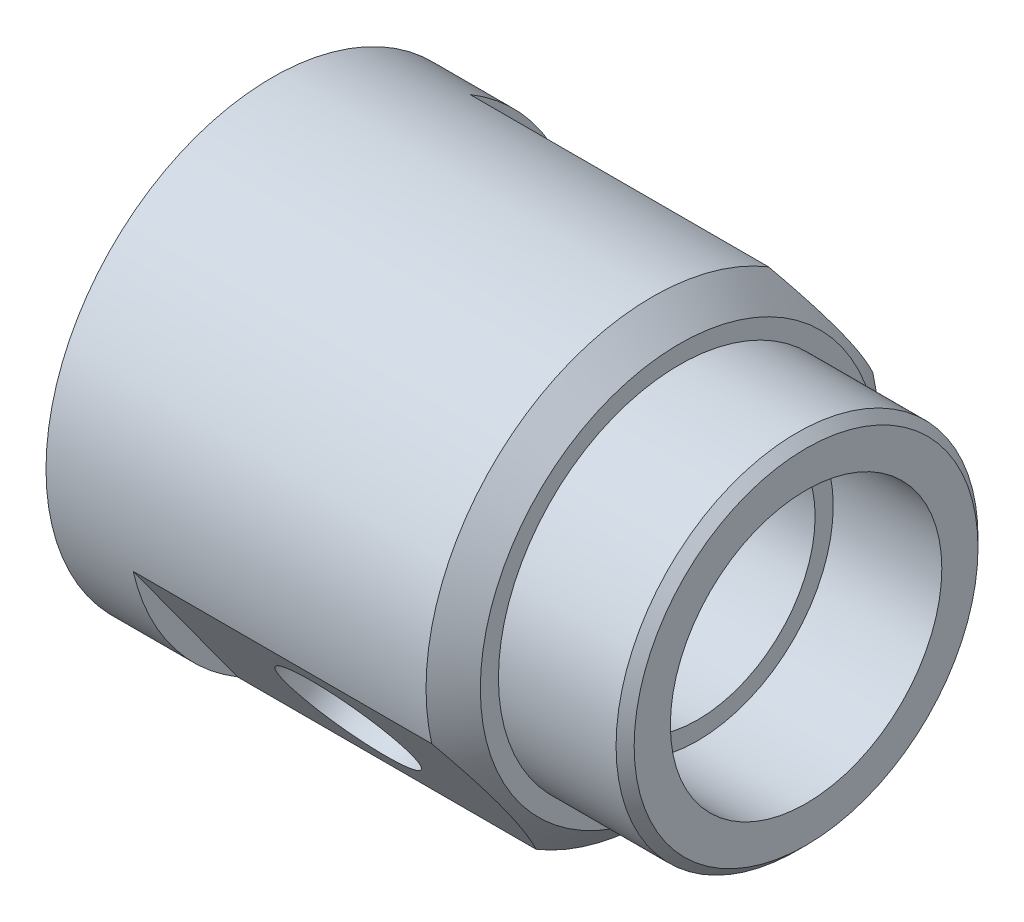
ISO-10303-21;
HEADER;
FILE_DESCRIPTION(('STEP AP214'),'2;1');
FILE_NAME('part.step','',(''),(''),'','','');
FILE_SCHEMA(('AUTOMOTIVE_DESIGN { 1 0 10303 214 1 1 1 1 }'));
ENDSEC;
DATA;
#1=APPLICATION_CONTEXT('core data for automotive mechanical design processes');
#2=APPLICATION_PROTOCOL_DEFINITION('international standard','automotive_design',2000,#1);
#3=PRODUCT_CONTEXT('',#1,'mechanical');
#4=PRODUCT('Part','Part','',(#3));
#5=PRODUCT_RELATED_PRODUCT_CATEGORY('part','',(#4));
#6=PRODUCT_DEFINITION_FORMATION('','',#4);
#7=PRODUCT_DEFINITION_CONTEXT('part definition',#1,'design');
#8=PRODUCT_DEFINITION('design','',#6,#7);
#9=PRODUCT_DEFINITION_SHAPE('','',#8);
#10=(LENGTH_UNIT() NAMED_UNIT(*) SI_UNIT(.MILLI.,.METRE.));
#11=(NAMED_UNIT(*) PLANE_ANGLE_UNIT() SI_UNIT($,.RADIAN.));
#12=(NAMED_UNIT(*) SI_UNIT($,.STERADIAN.) SOLID_ANGLE_UNIT());
#13=UNCERTAINTY_MEASURE_WITH_UNIT(LENGTH_MEASURE(1.E-05),#10,'distance_accuracy_value','');
#14=(GEOMETRIC_REPRESENTATION_CONTEXT(3) GLOBAL_UNCERTAINTY_ASSIGNED_CONTEXT((#13)) GLOBAL_UNIT_ASSIGNED_CONTEXT((#10,
#11,#12)) REPRESENTATION_CONTEXT('',''));
#15=CARTESIAN_POINT('',(0.,0.,0.));
#16=DIRECTION('',(0.,0.,1.));
#17=DIRECTION('',(1.,0.,0.));
#18=AXIS2_PLACEMENT_3D('',#15,#16,#17);
#19=CARTESIAN_POINT('',(-39.,13.079846408453,-14.600260885727));
#20=DIRECTION('',(1.,0.,0.));
#21=DIRECTION('',(0.,-0.809016994375046,-0.587785252292338));
#22=AXIS2_PLACEMENT_3D('',#19,#20,#21);
#23=PLANE('',#22);
#24=CARTESIAN_POINT('',(-39.,12.637382924288,-17.393865379061));
#25=DIRECTION('',(-1.,0.,0.));
#26=DIRECTION('',(0.,0.,1.));
#27=AXIS2_PLACEMENT_3D('',#24,#25,#26);
#28=CIRCLE('',#27,2.00000000000012);
#29=CARTESIAN_POINT('',(-39.,12.637382924288,-15.3938653790609));
#30=VERTEX_POINT('',#29);
#31=EDGE_CURVE('E252',#30,#30,#28,.F.);
#32=ORIENTED_EDGE('',*,*,#31,.F.);
#33=EDGE_LOOP('',(#32));
#34=FACE_BOUND('',#33,.T.);
#35=ADVANCED_FACE('F17',(#34),#23,.F.);
#36=CARTESIAN_POINT('',(-39.,-12.194919440123,20.187469872396));
#37=DIRECTION('',(1.,0.,0.));
#38=DIRECTION('',(0.,-0.809016994374953,-0.587785252292465));
#39=AXIS2_PLACEMENT_3D('',#36,#37,#38);
#40=PLANE('',#39);
#41=CARTESIAN_POINT('',(-39.,-12.637382924288,17.393865379061));
#42=DIRECTION('',(-1.,0.,0.));
#43=DIRECTION('',(0.,0.,1.));
#44=AXIS2_PLACEMENT_3D('',#41,#42,#43);
#45=CIRCLE('',#44,2.00000000000011);
#46=CARTESIAN_POINT('',(-39.,-12.637382924288,19.3938653790611));
#47=VERTEX_POINT('',#46);
#48=EDGE_CURVE('E249',#47,#47,#45,.F.);
#49=ORIENTED_EDGE('',*,*,#48,.F.);
#50=EDGE_LOOP('',(#49));
#51=FACE_BOUND('',#50,.T.);
#52=ADVANCED_FACE('F152',(#51),#40,.F.);
#53=CARTESIAN_POINT('',(-43.,-20.952033700011,3.3184761312371));
#54=DIRECTION('',(-1.,0.,0.));
#55=DIRECTION('',(0.,0.809016994374948,0.587785252292472));
#56=AXIS2_PLACEMENT_3D('',#53,#54,#55);
#57=PLANE('',#56);
#58=CARTESIAN_POINT('',(-43.,0.,0.));
#59=DIRECTION('',(-1.,0.,0.));
#60=DIRECTION('',(0.,0.,1.));
#61=AXIS2_PLACEMENT_3D('',#58,#59,#60);
#62=CIRCLE('',#61,12.9999999999998);
#63=CARTESIAN_POINT('',(-43.,0.,12.9999999999998));
#64=VERTEX_POINT('',#63);
#65=EDGE_CURVE('E247',#64,#64,#62,.T.);
#66=ORIENTED_EDGE('',*,*,#65,.F.);
#67=EDGE_LOOP('',(#66));
#68=FACE_BOUND('',#67,.T.);
#69=CARTESIAN_POINT('',(-43.0000000000001,0.,0.));
#70=DIRECTION('',(-1.,0.,0.));
#71=DIRECTION('',(0.,0.,1.));
#72=AXIS2_PLACEMENT_3D('',#69,#70,#71);
#73=CIRCLE('',#72,14.9999999999998);
#74=CARTESIAN_POINT('',(-43.0000000000001,0.,14.9999999999998));
#75=VERTEX_POINT('',#74);
#76=EDGE_CURVE('E261',#75,#75,#73,.F.);
#77=ORIENTED_EDGE('',*,*,#76,.F.);
#78=EDGE_LOOP('',(#77));
#79=FACE_BOUND('',#78,.T.);
#80=ADVANCED_FACE('F156',(#68,#79),#57,.T.);
#81=CARTESIAN_POINT('',(-43.0000000000001,0.,0.));
#82=DIRECTION('',(-1.,0.,0.));
#83=DIRECTION('',(0.,0.,1.));
#84=AXIS2_PLACEMENT_3D('',#81,#82,#83);
#85=CYLINDRICAL_SURFACE('',#84,14.9999999999998);
#86=ORIENTED_EDGE('',*,*,#76,.T.);
#87=EDGE_LOOP('',(#86));
#88=FACE_BOUND('',#87,.T.);
#89=CARTESIAN_POINT('',(-47.,0.,0.));
#90=DIRECTION('',(-1.,0.,0.));
#91=DIRECTION('',(0.,0.,1.));
#92=AXIS2_PLACEMENT_3D('',#89,#90,#91);
#93=CIRCLE('',#92,14.9999999999998);
#94=CARTESIAN_POINT('',(-47.,0.,14.9999999999998));
#95=VERTEX_POINT('',#94);
#96=EDGE_CURVE('E208',#95,#95,#93,.F.);
#97=ORIENTED_EDGE('',*,*,#96,.F.);
#98=EDGE_LOOP('',(#97));
#99=FACE_BOUND('',#98,.T.);
#100=ADVANCED_FACE('F160',(#88,#99),#85,.F.);
#101=CARTESIAN_POINT('',(-39.,12.637382924288,-17.393865379061));
#102=DIRECTION('',(-1.,0.,0.));
#103=DIRECTION('',(0.,0.,1.));
#104=AXIS2_PLACEMENT_3D('',#101,#102,#103);
#105=CYLINDRICAL_SURFACE('',#104,2.00000000000012);
#106=ORIENTED_EDGE('',*,*,#31,.T.);
#107=EDGE_LOOP('',(#106));
#108=FACE_BOUND('',#107,.T.);
#109=CARTESIAN_POINT('',(-47.,12.637382924288,-17.393865379061));
#110=DIRECTION('',(-1.,0.,0.));
#111=DIRECTION('',(0.,0.,1.));
#112=AXIS2_PLACEMENT_3D('',#109,#110,#111);
#113=CIRCLE('',#112,2.00000000000012);
#114=CARTESIAN_POINT('',(-47.,12.637382924288,-15.3938653790609));
#115=VERTEX_POINT('',#114);
#116=EDGE_CURVE('E203',#115,#115,#113,.F.);
#117=ORIENTED_EDGE('',*,*,#116,.F.);
#118=EDGE_LOOP('',(#117));
#119=FACE_BOUND('',#118,.T.);
#120=ADVANCED_FACE('F269',(#108,#119),#105,.F.);
#121=CARTESIAN_POINT('',(-39.,-12.637382924288,17.393865379061));
#122=DIRECTION('',(-1.,0.,0.));
#123=DIRECTION('',(0.,0.,1.));
#124=AXIS2_PLACEMENT_3D('',#121,#122,#123);
#125=CYLINDRICAL_SURFACE('',#124,2.00000000000011);
#126=ORIENTED_EDGE('',*,*,#48,.T.);
#127=EDGE_LOOP('',(#126));
#128=FACE_BOUND('',#127,.T.);
#129=CARTESIAN_POINT('',(-47.,-12.637382924288,17.393865379061));
#130=DIRECTION('',(-1.,0.,0.));
#131=DIRECTION('',(0.,0.,1.));
#132=AXIS2_PLACEMENT_3D('',#129,#130,#131);
#133=CIRCLE('',#132,2.00000000000011);
#134=CARTESIAN_POINT('',(-47.,-12.637382924288,19.3938653790611));
#135=VERTEX_POINT('',#134);
#136=EDGE_CURVE('E198',#135,#135,#133,.F.);
#137=ORIENTED_EDGE('',*,*,#136,.F.);
#138=EDGE_LOOP('',(#137));
#139=FACE_BOUND('',#138,.T.);
#140=ADVANCED_FACE('F233',(#128,#139),#125,.F.);
#141=CARTESIAN_POINT('',(0.,0.,0.));
#142=DIRECTION('',(-1.,0.,0.));
#143=DIRECTION('',(0.,0.,1.));
#144=AXIS2_PLACEMENT_3D('',#141,#142,#143);
#145=CYLINDRICAL_SURFACE('',#144,12.9999999999998);
#146=ORIENTED_EDGE('',*,*,#65,.T.);
#147=EDGE_LOOP('',(#146));
#148=FACE_BOUND('',#147,.T.);
#149=CARTESIAN_POINT('',(-26.9401139856556,-6.88486211806936,11.0271788602806));
#150=CARTESIAN_POINT('',(-26.9001265097293,-6.6265743795105,11.1884434101272));
#151=CARTESIAN_POINT('',(-26.8402386761246,-6.36482471135391,11.3391824314615));
#152=CARTESIAN_POINT('',(-26.6820678966312,-5.83846807973158,11.6190329210566));
#153=CARTESIAN_POINT('',(-26.5834697191048,-5.57385545970108,11.7479540588096));
#154=CARTESIAN_POINT('',(-26.3496849134917,-5.04742414091861,11.9836373109982));
#155=CARTESIAN_POINT('',(-26.2141434447447,-4.78565956639717,12.090165788977));
#156=CARTESIAN_POINT('',(-25.9088063905075,-4.27094860076021,12.2814951247914));
#157=CARTESIAN_POINT('',(-25.738705405178,-4.01810623813091,12.3660857779135));
#158=CARTESIAN_POINT('',(-25.367075862861,-3.52756117275891,12.5148890061049));
#159=CARTESIAN_POINT('',(-25.1653561164376,-3.28996385204857,12.5789698806575));
#160=CARTESIAN_POINT('',(-24.7337794324433,-2.8364048963516,12.688946653124));
#161=CARTESIAN_POINT('',(-24.5038755004305,-2.62048051957579,12.7348116228585));
#162=CARTESIAN_POINT('',(-24.0196634482771,-2.21675606665058,12.8112476143688));
#163=CARTESIAN_POINT('',(-23.7654464985882,-2.02885719907983,12.8418732927498));
#164=CARTESIAN_POINT('',(-23.2367581439838,-1.68738478457142,12.8911705800809));
#165=CARTESIAN_POINT('',(-22.9624723890978,-1.53353924989184,12.9099393097168));
#166=CARTESIAN_POINT('',(-22.3982036339946,-1.26571193356446,12.9389328806034));
#167=CARTESIAN_POINT('',(-22.1084254662127,-1.15131198931648,12.9492490495154));
#168=CARTESIAN_POINT('',(-21.5181284762339,-0.966775410068707,12.9643324247975));
#169=CARTESIAN_POINT('',(-21.2177527596713,-0.896190659238275,12.9691562438017));
#170=CARTESIAN_POINT('',(-20.6115534398097,-0.802033188349739,12.975323611714));
#171=CARTESIAN_POINT('',(-20.3057767892592,-0.778163560586964,12.9766891568331));
#172=CARTESIAN_POINT('',(-19.6942235885914,-0.778163546175504,12.9766891576935));
#173=CARTESIAN_POINT('',(-19.3884470384742,-0.802033143729543,12.9753236143386));
#174=CARTESIAN_POINT('',(-18.7822478406981,-0.896190536026768,12.9691562523165));
#175=CARTESIAN_POINT('',(-18.4818721474201,-0.966775249004503,12.9643324366641));
#176=CARTESIAN_POINT('',(-17.891575234113,-1.15131173590998,12.9492490718699));
#177=CARTESIAN_POINT('',(-17.6017971179548,-1.26571162030983,12.9389329107942));
#178=CARTESIAN_POINT('',(-17.0375285436373,-1.53353876264018,12.9099393668486));
#179=CARTESIAN_POINT('',(-16.7632429118882,-1.6873841710139,12.8911706590182));
#180=CARTESIAN_POINT('',(-16.2345552166393,-2.02885602145011,12.8418734737035));
#181=CARTESIAN_POINT('',(-15.9803387657149,-2.21675439650429,12.8112478951491));
#182=CARTESIAN_POINT('',(-15.4961281000517,-2.62047733861116,12.7348122641486));
#183=CARTESIAN_POINT('',(-15.2662250026449,-2.83640063961823,12.688947586978));
#184=CARTESIAN_POINT('',(-14.8346475247214,-3.28995961511984,12.5789710143177));
#185=CARTESIAN_POINT('',(-14.6329264333511,-3.52755825612374,12.514889860368));
#186=CARTESIAN_POINT('',(-14.2612955139674,-4.01810490916097,12.3660862134588));
#187=CARTESIAN_POINT('',(-14.0911943396077,-4.27094745262476,12.2814955290681));
#188=CARTESIAN_POINT('',(-13.7858570336243,-4.78565867659862,12.0901661432747));
#189=CARTESIAN_POINT('',(-13.6503154853277,-5.04742332280124,11.9836376581871));
#190=CARTESIAN_POINT('',(-13.4165305430915,-5.57385478878041,11.7479543788977));
#191=CARTESIAN_POINT('',(-13.3179323077765,-5.83846748416484,11.6190332216383));
#192=CARTESIAN_POINT('',(-13.1597614036501,-6.3648243664639,11.339182628965));
#193=CARTESIAN_POINT('',(-13.0998735168511,-6.62657420965677,11.1884435158306));
#194=CARTESIAN_POINT('',(-13.0200858230962,-7.14194014263927,10.8666696078865));
#195=CARTESIAN_POINT('',(-13.0000000162464,-7.39558858956793,10.6957331905625));
#196=CARTESIAN_POINT('',(-12.9999999837467,-7.89013242441459,10.3363074399215));
#197=CARTESIAN_POINT('',(-13.0200861997147,-8.13102767210455,10.1478179136618));
#198=CARTESIAN_POINT('',(-13.099873802457,-8.59619685541647,9.75695442824458));
#199=CARTESIAN_POINT('',(-13.1597620167837,-8.82038683199593,9.55451904433759));
#200=CARTESIAN_POINT('',(-13.3179327537865,-9.2490813355208,9.14024833004198));
#201=CARTESIAN_POINT('',(-13.4165311737708,-9.45340618338896,8.92834870807931));
#202=CARTESIAN_POINT('',(-13.6503158199979,-9.84011906198837,8.50036016348436));
#203=CARTESIAN_POINT('',(-13.7858573672119,-10.022267816125,8.28425053691281));
#204=CARTESIAN_POINT('',(-14.0911941446944,-10.3631776785555,7.8537053183451));
#205=CARTESIAN_POINT('',(-14.2612950537778,-10.521706503945,7.63930377883474));
#206=CARTESIAN_POINT('',(-14.6329242133619,-10.8147072339204,7.21860494641994));
#207=CARTESIAN_POINT('',(-14.8346437370019,-10.9490212592527,7.01236723174584));
#208=CARTESIAN_POINT('',(-15.2662199553112,-11.1936717958905,6.61485347769445));
#209=CARTESIAN_POINT('',(-15.496123549622,-11.3039674692513,6.42360326921449));
#210=CARTESIAN_POINT('',(-15.9803351161336,-11.501327158323,6.06313118363484));
#211=CARTESIAN_POINT('',(-16.2345516606267,-11.5884738884672,5.8938320138853));
#212=CARTESIAN_POINT('',(-16.763239637726,-11.7407976811128,5.58419436187309));
#213=CARTESIAN_POINT('',(-17.0375250437074,-11.8061514220383,5.44362674371439));
#214=CARTESIAN_POINT('',(-17.6017937372304,-11.9164230437451,5.19777642598322));
#215=CARTESIAN_POINT('',(-17.8915717898523,-11.9615572599152,5.09212353514575));
#216=CARTESIAN_POINT('',(-18.481869214207,-12.0328805404042,4.9212152538028));
#217=CARTESIAN_POINT('',(-18.7822451892518,-12.0592621224424,4.85555037207487));
#218=CARTESIAN_POINT('',(-19.3884453857624,-12.0941995856712,4.76787348443744));
#219=CARTESIAN_POINT('',(-19.6942225540976,-12.1028682466344,4.74558533843154));
#220=CARTESIAN_POINT('',(-20.3057768838841,-12.1028682571251,4.74558531174386));
#221=CARTESIAN_POINT('',(-20.6115540453353,-12.0941996071709,4.76787342972952));
#222=CARTESIAN_POINT('',(-21.217754211031,-12.0592621685413,4.85555025753522));
#223=CARTESIAN_POINT('',(-21.5181301627041,-12.0328806013685,4.92121510434585));
#224=CARTESIAN_POINT('',(-22.10842751039,-11.9615573593333,5.09212330117587));
#225=CARTESIAN_POINT('',(-22.3982055114784,-11.9164231690693,5.19777613754134));
#226=CARTESIAN_POINT('',(-22.9624740244875,-11.8061516266245,5.44362629823357));
#227=CARTESIAN_POINT('',(-23.2367593075056,-11.7407979453671,5.58419380311203));
#228=CARTESIAN_POINT('',(-23.7654466268408,-11.5884744233682,5.89383095107402));
#229=CARTESIAN_POINT('',(-24.0196626738877,-11.5013279396628,6.06312968416583));
#230=CARTESIAN_POINT('',(-24.503872847607,-11.3039690621018,6.42360043968942));
#231=CARTESIAN_POINT('',(-24.7337756005959,-11.1936740026934,6.61484970919865));
#232=CARTESIAN_POINT('',(-25.1653526123656,-10.9490236520783,7.01236354155953));
#233=CARTESIAN_POINT('',(-25.3670734857449,-10.8147089506471,7.21860243039655));
#234=CARTESIAN_POINT('',(-25.7387040267323,-10.5217073289084,7.63930264866833));
#235=CARTESIAN_POINT('',(-25.9088051250374,-10.3631784178863,7.85370435073795));
#236=CARTESIAN_POINT('',(-26.2141421542842,-10.0222684278866,8.28424979974064));
#237=CARTESIAN_POINT('',(-26.3496837808961,-9.84011964466354,8.50035949223341));
#238=CARTESIAN_POINT('',(-26.583468547555,-9.45340672287969,8.92834813825049));
#239=CARTESIAN_POINT('',(-26.6820670143708,-9.24908186484591,9.14024779600192));
#240=CARTESIAN_POINT('',(-26.8402378294264,-8.82038734863029,9.55451856807762));
#241=CARTESIAN_POINT('',(-26.9001260779319,-8.59619737123687,9.75695397454376));
#242=CARTESIAN_POINT('',(-26.9799137508428,-8.13102814250106,10.1478175388869));
#243=CARTESIAN_POINT('',(-26.9999999963548,-7.89013284732179,10.3363071193781));
#244=CARTESIAN_POINT('',(-27.0000000036452,-7.39558884301887,10.6957330195489));
#245=CARTESIAN_POINT('',(-26.9799141964567,-7.14194027076225,10.8666695275467));
#246=CARTESIAN_POINT('',(-26.9401139856556,-6.88486211806936,11.0271788602806));
#247=B_SPLINE_CURVE_WITH_KNOTS('',3,(#149,#150,#151,#152,#153,#154,#155,#156,#157,#158,#159,
#160,#161,#162,#163,#164,#165,#166,#167,#168,#169,#170,#171,#172,#173,#174,#175,#176,#177,#178,
#179,#180,#181,#182,#183,#184,#185,#186,#187,#188,#189,#190,#191,#192,#193,#194,#195,#196,#197,
#198,#199,#200,#201,#202,#203,#204,#205,#206,#207,#208,#209,#210,#211,#212,#213,#214,#215,#216,
#217,#218,#219,#220,#221,#222,#223,#224,#225,#226,#227,#228,#229,#230,#231,#232,#233,#234,#235,
#236,#237,#238,#239,#240,#241,#242,#243,#244,#245,#246),.UNSPECIFIED.,.T.,.F.,(4,2,2,2,2,2,2,2,
2,2,2,2,2,2,2,2,2,2,2,2,2,2,2,2,2,2,2,2,2,2,2,2,2,2,2,2,2,2,2,2,2,2,2,2,2,2,2,2,4),(0.,
0.920514281228124,1.84868551544849,2.78610671779294,3.73220339300767,4.68425876638826,
5.63792376251925,6.58814327651164,7.53047499616157,8.46248557632013,9.38479988826352,
10.301232954009,11.2176657164998,12.1399799348078,13.0719903061043,14.0143215192729,
14.9645389476927,15.9181998630062,16.8702608686991,17.8163583052405,18.7537797942885,
19.6819512988162,20.6024661849372,21.518669153809,22.4348821947154,23.3554265338774,
24.2836446271388,25.2211262057751,26.1672921737164,27.119420027433,28.0731543400549,
29.0234335329111,29.9658099551017,30.897847578995,31.8201728662319,32.7366070917466,
33.6530412898653,34.575366483547,35.5074038987865,36.4497798151625,37.4000569275503,
38.3537871304025,39.3059206377951,40.2520873678339,41.18956923334,42.1177874636942,
43.0383318685291,43.9545451250878,44.8707485510263),.UNSPECIFIED.);
#248=CARTESIAN_POINT('',(-26.9401139856556,-6.88486211806936,11.0271788602806));
#249=VERTEX_POINT('',#248);
#250=EDGE_CURVE('E213',#249,#249,#247,.T.);
#251=ORIENTED_EDGE('',*,*,#250,.F.);
#252=EDGE_LOOP('',(#251));
#253=FACE_BOUND('',#252,.T.);
#254=CARTESIAN_POINT('',(-26.9401139856545,6.88139060990192,-11.0293455506388));
#255=CARTESIAN_POINT('',(-26.9001261045306,6.62304375189662,-11.1905340110815));
#256=CARTESIAN_POINT('',(-26.8402379092091,6.36123790152272,-11.3411952773584));
#257=CARTESIAN_POINT('',(-26.6820672187834,5.83476934405305,-11.6208911786486));
#258=CARTESIAN_POINT('',(-26.5834688097662,5.57010101562971,-11.7497350514851));
#259=CARTESIAN_POINT('',(-26.349684179761,5.04355890744211,-11.9852651035857));
#260=CARTESIAN_POINT('',(-26.214142632723,4.78173937837461,-12.0917173160757));
#261=CARTESIAN_POINT('',(-25.9088058553708,4.26691960169203,-12.2828960729672));
#262=CARTESIAN_POINT('',(-25.7387049462396,4.0140235192798,-12.3674122259936));
#263=CARTESIAN_POINT('',(-25.3670757866202,3.52337294837718,-12.5160693907477));
#264=CARTESIAN_POINT('',(-25.165356262993,3.28572390952349,-12.5800786610687));
#265=CARTESIAN_POINT('',(-24.7337800446932,2.83206468991467,-12.6899166426638));
#266=CARTESIAN_POINT('',(-24.5038764503791,2.61609169542164,-12.7357144969309));
#267=CARTESIAN_POINT('',(-24.019664883865,2.21227487156028,-12.8120227148318));
#268=CARTESIAN_POINT('',(-23.7654483393729,2.02433197234811,-12.8425878598241));
#269=CARTESIAN_POINT('',(-23.2367603622742,1.68277842513661,-12.8917730988372));
#270=CARTESIAN_POINT('',(-22.9624749562926,1.52889525931468,-12.9104904171385));
#271=CARTESIAN_POINT('',(-22.3982062627692,1.26100190749843,-12.9393930352735));
#272=CARTESIAN_POINT('',(-22.1084282101472,1.14657279737761,-12.9496696868965));
#273=CARTESIAN_POINT('',(-21.5181307857926,0.961989256952032,-12.9646885941547));
#274=CARTESIAN_POINT('',(-21.217754810748,0.891385886104697,-12.9694874052748));
#275=CARTESIAN_POINT('',(-20.6115546142377,0.797203940910647,-12.9756212590474));
#276=CARTESIAN_POINT('',(-20.3057774459025,0.773327890859465,-12.9769782296551));
#277=CARTESIAN_POINT('',(-19.6942231161161,0.773327862236145,-12.9769782313855));
#278=CARTESIAN_POINT('',(-19.3884459546649,0.797203882236499,-12.9756212625892));
#279=CARTESIAN_POINT('',(-18.7822457889691,0.891385762925687,-12.9694874137227));
#280=CARTESIAN_POINT('',(-18.4818698372958,0.961989095971162,-12.9646886059504));
#281=CARTESIAN_POINT('',(-17.8915724896099,1.14657254413741,-12.949669709148));
#282=CARTESIAN_POINT('',(-17.6017944885217,1.26100159444668,-12.9393930653306));
#283=CARTESIAN_POINT('',(-17.0375259755128,1.52889477241649,-12.9104904740503));
#284=CARTESIAN_POINT('',(-16.7632406924948,1.68277781206395,-12.8917731774909));
#285=CARTESIAN_POINT('',(-16.2345533731595,2.02433079626093,-12.8425880401189));
#286=CARTESIAN_POINT('',(-15.9803373261127,2.21227320403339,-12.8120229945702));
#287=CARTESIAN_POINT('',(-15.4961271523932,2.61608851216516,-12.7357151374489));
#288=CARTESIAN_POINT('',(-15.2662243994042,2.83206042392148,-12.6899175769236));
#289=CARTESIAN_POINT('',(-14.8346473876345,3.28571966052569,-12.5800797964558));
#290=CARTESIAN_POINT('',(-14.6329265142552,3.52337002500418,-12.5160702459771));
#291=CARTESIAN_POINT('',(-14.2612959732681,4.01402218949455,-12.3674126613208));
#292=CARTESIAN_POINT('',(-14.0911948749632,4.26691845295784,-12.2828964770344));
#293=CARTESIAN_POINT('',(-13.7858578457156,4.7817384882563,-12.0917176701677));
#294=CARTESIAN_POINT('',(-13.6503162191027,5.04355808905829,-11.9852654505774));
#295=CARTESIAN_POINT('',(-13.4165314524466,5.57010034452474,-11.7497353713983));
#296=CARTESIAN_POINT('',(-13.3179329856346,5.83476874833013,-11.620891479072));
#297=CARTESIAN_POINT('',(-13.1597621705687,6.36123755654476,-11.3411954747679));
#298=CARTESIAN_POINT('',(-13.0998739220492,6.62304358199707,-11.1905341167394));
#299=CARTESIAN_POINT('',(-13.0200862576856,7.13852206375552,-10.8689154087396));
#300=CARTESIAN_POINT('',(-13.000000012305,7.3922269940235,-10.6980568909149));
#301=CARTESIAN_POINT('',(-12.9999999877024,7.88688366378091,-10.3387864442002));
#302=CARTESIAN_POINT('',(-13.0200857651299,8.12783554398665,-10.1503747090545));
#303=CARTESIAN_POINT('',(-13.099873397258,8.5931175517337,-9.75966622329262));
#304=CARTESIAN_POINT('',(-13.1597612498688,8.81736411654015,-9.55730829953019));
#305=CARTESIAN_POINT('',(-13.3179320759407,9.24617105533169,-9.14319180351097));
#306=CARTESIAN_POINT('',(-13.4165302644331,9.45055217166924,-8.93136903956303));
#307=CARTESIAN_POINT('',(-13.6503150862675,9.83737651640897,-8.50353320339608));
#308=CARTESIAN_POINT('',(-13.7858565551907,10.0195808214471,-8.28749940903566));
#309=CARTESIAN_POINT('',(-14.0911936095583,10.3606002684812,-7.85710420736807));
#310=CARTESIAN_POINT('',(-14.2612945948399,10.5191833473465,-7.64277678020309));
#311=CARTESIAN_POINT('',(-14.6329241371215,10.8122903889039,-7.22222342559496));
#312=CARTESIAN_POINT('',(-14.8346438835581,10.9466565321223,-7.01605702472234));
#313=CARTESIAN_POINT('',(-15.2662205675619,11.1914080834699,-6.61868151605565));
#314=CARTESIAN_POINT('',(-15.496124499571,11.3017525637323,-6.42749828559277));
#315=CARTESIAN_POINT('',(-15.9803365517218,11.4992052285386,-6.06715353421076));
#316=CARTESIAN_POINT('',(-16.2345535014116,11.5863959228312,-5.89791494688655));
#317=CARTESIAN_POINT('',(-16.7632418560166,11.7388012083758,-5.58838908149478));
#318=CARTESIAN_POINT('',(-17.0375276109024,11.8041922157235,-5.44787313965533));
#319=CARTESIAN_POINT('',(-17.6017963660057,11.914529932549,-5.20211373135192));
#320=CARTESIAN_POINT('',(-17.8915745337878,11.9596927191441,-5.09650079042162));
#321=CARTESIAN_POINT('',(-18.4818715237666,12.0310628005652,-4.92565709352796));
#322=CARTESIAN_POINT('',(-18.7822472403289,12.0574624126129,-4.86001764834978));
#323=CARTESIAN_POINT('',(-19.3884465601903,12.0924241867062,-4.77237439359888));
#324=CARTESIAN_POINT('',(-19.6942232107408,12.1010990179181,-4.75009500522193));
#325=CARTESIAN_POINT('',(-20.3057764114085,12.1010990231898,-4.7500949917817));
#326=CARTESIAN_POINT('',(-20.6115529615258,12.0924242029908,-4.77237435197359));
#327=CARTESIAN_POINT('',(-21.217752159302,12.0574624587854,-4.86001753379994));
#328=CARTESIAN_POINT('',(-21.5181278525802,12.0310628616225,-4.92565694401398));
#329=CARTESIAN_POINT('',(-22.1084247658872,11.9596928187113,-5.09650055632594));
#330=CARTESIAN_POINT('',(-22.3982028820452,11.914530058063,-5.20211344275864));
#331=CARTESIAN_POINT('',(-22.9624714563625,11.8041924206282,-5.44787269390617));
#332=CARTESIAN_POINT('',(-23.2367570881116,11.7388014730496,-5.58838852236));
#333=CARTESIAN_POINT('',(-23.7654447833604,11.5863964588357,-5.8979138828116));
#334=CARTESIAN_POINT('',(-24.0196612342848,11.499206011679,-6.06715203257223));
#335=CARTESIAN_POINT('',(-24.503871899948,11.3017541566088,-6.42749545848596));
#336=CARTESIAN_POINT('',(-24.7337749973549,11.1914102870251,-6.61867775624149));
#337=CARTESIAN_POINT('',(-25.1653524752785,10.9466589195755,-7.01605334548131));
#338=CARTESIAN_POINT('',(-25.3670735666487,10.8122921026294,-7.22222091568124));
#339=CARTESIAN_POINT('',(-25.7387044860325,10.5191841722655,-7.64277565087938));
#340=CARTESIAN_POINT('',(-25.9088056603924,10.3606010078264,-7.85710324039503));
#341=CARTESIAN_POINT('',(-26.214142966375,10.0195814333059,-8.28749867223096));
#342=CARTESIAN_POINT('',(-26.3496845146706,9.8373770991898,-8.50353253245913));
#343=CARTESIAN_POINT('',(-26.5834694569095,9.45055271127682,-8.93136846997497));
#344=CARTESIAN_POINT('',(-26.682067692228,9.24617158477349,-9.14319126969252));
#345=CARTESIAN_POINT('',(-26.8402385963451,8.81736463329192,-9.55730782346373));
#346=CARTESIAN_POINT('',(-26.9001264831314,8.59311806767154,-9.75966576977663));
#347=CARTESIAN_POINT('',(-26.9799141854301,8.12783601448951,-10.1503743344366));
#348=CARTESIAN_POINT('',(-26.9999999924062,7.88688408678377,-10.3387861237936));
#349=CARTESIAN_POINT('',(-27.0000000075939,7.39222724752946,-10.6980567199805));
#350=CARTESIAN_POINT('',(-26.9799137618689,7.1385221919045,-10.8689153284399));
#351=CARTESIAN_POINT('',(-26.9401139856545,6.88139060990192,-11.0293455506388));
#352=B_SPLINE_CURVE_WITH_KNOTS('',3,(#254,#255,#256,#257,#258,#259,#260,#261,#262,#263,#264,
#265,#266,#267,#268,#269,#270,#271,#272,#273,#274,#275,#276,#277,#278,#279,#280,#281,#282,#283,
#284,#285,#286,#287,#288,#289,#290,#291,#292,#293,#294,#295,#296,#297,#298,#299,#300,#301,#302,
#303,#304,#305,#306,#307,#308,#309,#310,#311,#312,#313,#314,#315,#316,#317,#318,#319,#320,#321,
#322,#323,#324,#325,#326,#327,#328,#329,#330,#331,#332,#333,#334,#335,#336,#337,#338,#339,#340,
#341,#342,#343,#344,#345,#346,#347,#348,#349,#350,#351),.UNSPECIFIED.,.T.,.F.,(4,2,2,2,2,2,2,2,
2,2,2,2,2,2,2,2,2,2,2,2,2,2,2,2,2,2,2,2,2,2,2,2,2,2,2,2,2,2,2,2,2,2,2,2,2,2,2,2,4),(0.,
0.920543799897024,1.8487617598732,2.78624333850959,3.73240930645073,4.68453716016791,
5.6382714727892,6.58855066564554,7.53092708783599,8.46296471172999,9.38528999896607,
10.3017242244807,11.2181584225992,12.1404836162815,13.0725210315204,14.0148969478963,
14.9651740602841,15.9189042631369,16.8710377705288,17.8172045005677,18.7546863660738,
19.6829045964286,20.6034490012629,21.5196620619342,22.4358650110631,23.3563798315436,
24.2845511990387,25.2219724013833,26.1680690765981,27.120124449979,28.0737894461094,
29.0240089601018,29.9663406797517,30.8983512599109,31.8206655718536,32.737098637599,
33.6535314000897,34.5758456183983,35.5078559896941,36.4501872028627,37.4004046312824,
38.354065546596,39.306126552289,40.2522239888301,41.189645477878,42.1178169824062,
43.038331868527,43.9545350332839,44.8707485510243),.UNSPECIFIED.);
#353=CARTESIAN_POINT('',(-26.9401139856545,6.88139060990192,-11.0293455506388));
#354=VERTEX_POINT('',#353);
#355=EDGE_CURVE('E222',#354,#354,#352,.T.);
#356=ORIENTED_EDGE('',*,*,#355,.F.);
#357=EDGE_LOOP('',(#356));
#358=FACE_BOUND('',#357,.T.);
#359=CARTESIAN_POINT('',(0.,0.,0.));
#360=DIRECTION('',(-1.,0.,0.));
#361=DIRECTION('',(0.,0.,1.));
#362=AXIS2_PLACEMENT_3D('',#359,#360,#361);
#363=CIRCLE('',#362,12.9999999999998);
#364=CARTESIAN_POINT('',(0.,0.,12.9999999999998));
#365=VERTEX_POINT('',#364);
#366=EDGE_CURVE('E97',#365,#365,#363,.T.);
#367=ORIENTED_EDGE('',*,*,#366,.F.);
#368=EDGE_LOOP('',(#367));
#369=FACE_BOUND('',#368,.T.);
#370=ADVANCED_FACE('F228',(#148,#253,#358,#369),#145,.F.);
#371=CARTESIAN_POINT('',(-20.,6.39396105396549,-8.80400480058663));
#372=DIRECTION('',(0.,0.587785252292483,-0.809016994374941));
#373=DIRECTION('',(0.,0.809016994374941,0.587785252292483));
#374=AXIS2_PLACEMENT_3D('',#371,#372,#373);
#375=CYLINDRICAL_SURFACE('',#374,7.);
#376=CARTESIAN_POINT('',(-20.,13.517409575687,-18.608590557291));
#377=DIRECTION('',(0.,0.587785252292483,-0.809016994374941));
#378=DIRECTION('',(0.,0.809016994374941,0.587785252292483));
#379=AXIS2_PLACEMENT_3D('',#376,#377,#378);
#380=CIRCLE('',#379,7.);
#381=CARTESIAN_POINT('',(-20.,19.1805285363116,-14.4940937912436));
#382=VERTEX_POINT('',#381);
#383=EDGE_CURVE('E96',#382,#382,#380,.T.);
#384=ORIENTED_EDGE('',*,*,#383,.T.);
#385=EDGE_LOOP('',(#384));
#386=FACE_BOUND('',#385,.T.);
#387=ORIENTED_EDGE('',*,*,#355,.T.);
#388=EDGE_LOOP('',(#387));
#389=FACE_BOUND('',#388,.T.);
#390=ADVANCED_FACE('F232',(#386,#389),#375,.F.);
#391=CARTESIAN_POINT('',(-20.,-13.520712029767,18.606191183956));
#392=DIRECTION('',(0.,0.587785252292483,-0.809016994374941));
#393=DIRECTION('',(0.,0.809016994374941,0.587785252292483));
#394=AXIS2_PLACEMENT_3D('',#391,#392,#393);
#395=CYLINDRICAL_SURFACE('',#394,7.);
#396=ORIENTED_EDGE('',*,*,#250,.T.);
#397=EDGE_LOOP('',(#396));
#398=FACE_BOUND('',#397,.T.);
#399=CARTESIAN_POINT('',(-20.,-13.520712029767,18.606191183956));
#400=DIRECTION('',(0.,0.587785252292483,-0.809016994374941));
#401=DIRECTION('',(0.,0.809016994374941,0.587785252292483));
#402=AXIS2_PLACEMENT_3D('',#399,#400,#401);
#403=CIRCLE('',#402,7.);
#404=CARTESIAN_POINT('',(-20.,-7.85759306914242,22.7206879500034));
#405=VERTEX_POINT('',#404);
#406=EDGE_CURVE('E100',#405,#405,#403,.F.);
#407=ORIENTED_EDGE('',*,*,#406,.T.);
#408=EDGE_LOOP('',(#407));
#409=FACE_BOUND('',#408,.T.);
#410=ADVANCED_FACE('F166',(#398,#409),#395,.F.);
#411=CARTESIAN_POINT('',(-47.,-34.920056166686,5.5307935520619));
#412=DIRECTION('',(-1.,0.,0.));
#413=DIRECTION('',(0.,0.809016994374947,0.587785252292474));
#414=AXIS2_PLACEMENT_3D('',#411,#412,#413);
#415=PLANE('',#414);
#416=ORIENTED_EDGE('',*,*,#136,.T.);
#417=EDGE_LOOP('',(#416));
#418=FACE_BOUND('',#417,.T.);
#419=ORIENTED_EDGE('',*,*,#116,.T.);
#420=EDGE_LOOP('',(#419));
#421=FACE_BOUND('',#420,.T.);
#422=ORIENTED_EDGE('',*,*,#96,.T.);
#423=EDGE_LOOP('',(#422));
#424=FACE_BOUND('',#423,.T.);
#425=CARTESIAN_POINT('',(-47.,0.,0.));
#426=DIRECTION('',(-1.,0.,0.));
#427=DIRECTION('',(0.,0.,1.));
#428=AXIS2_PLACEMENT_3D('',#425,#426,#427);
#429=CIRCLE('',#428,25.0000000000004);
#430=CARTESIAN_POINT('',(-47.,0.,25.0000000000004));
#431=VERTEX_POINT('',#430);
#432=EDGE_CURVE('E103',#431,#431,#429,.T.);
#433=ORIENTED_EDGE('',*,*,#432,.T.);
#434=EDGE_LOOP('',(#433));
#435=FACE_BOUND('',#434,.T.);
#436=ADVANCED_FACE('F162',(#418,#421,#424,#435),#415,.T.);
#437=CARTESIAN_POINT('',(-38.,22.621346625147,-14.466329073575));
#438=DIRECTION('',(-1.,0.,0.));
#439=DIRECTION('',(0.,-0.809016994374949,-0.587785252292472));
#440=AXIS2_PLACEMENT_3D('',#437,#438,#439);
#441=PLANE('',#440);
#442=CARTESIAN_POINT('',(-38.0000000000002,0.,0.));
#443=DIRECTION('',(-1.,0.,0.));
#444=DIRECTION('',(0.,0.,1.));
#445=AXIS2_PLACEMENT_3D('',#442,#443,#444);
#446=CIRCLE('',#445,25.0000000000004);
#447=CARTESIAN_POINT('',(-38.0000000000002,-5.59234548489124,24.3664866564229));
#448=VERTEX_POINT('',#447);
#449=CARTESIAN_POINT('',(-38.0000000000001,-21.4457761205624,12.8482950848247));
#450=VERTEX_POINT('',#449);
#451=EDGE_CURVE('E87',#448,#450,#446,.F.);
#452=ORIENTED_EDGE('',*,*,#451,.T.);
#453=DIRECTION('',(0.,0.809016994374944,0.587785252292478));
#454=VECTOR('',#453,1.);
#455=CARTESIAN_POINT('',(-38.,-7.2879787190003,23.1345369999435));
#456=LINE('',#455,#454);
#457=EDGE_CURVE('E98',#450,#448,#456,.T.);
#458=ORIENTED_EDGE('',*,*,#457,.T.);
#459=EDGE_LOOP('',(#452,#458));
#460=FACE_BOUND('',#459,.T.);
#461=ADVANCED_FACE('F165',(#460),#441,.F.);
#462=CARTESIAN_POINT('',(-38.,23.8991406518698,-16.2250616700423));
#463=DIRECTION('',(-1.,0.,0.));
#464=DIRECTION('',(0.,-0.809016994374949,-0.587785252292472));
#465=AXIS2_PLACEMENT_3D('',#462,#463,#464);
#466=PLANE('',#465);
#467=CARTESIAN_POINT('',(-38.0000000000002,0.,0.));
#468=DIRECTION('',(-1.,0.,0.));
#469=DIRECTION('',(0.,0.,1.));
#470=AXIS2_PLACEMENT_3D('',#467,#468,#469);
#471=CIRCLE('',#470,25.0000000000004);
#472=CARTESIAN_POINT('',(-38.0000000000001,5.59234548489131,-24.3664866564229));
#473=VERTEX_POINT('',#472);
#474=CARTESIAN_POINT('',(-38.0000000000001,21.4457761205625,-12.8482950848247));
#475=VERTEX_POINT('',#474);
#476=EDGE_CURVE('E78',#473,#475,#471,.F.);
#477=ORIENTED_EDGE('',*,*,#476,.T.);
#478=DIRECTION('',(0.,-0.809016994374944,-0.587785252292478));
#479=VECTOR('',#478,1.);
#480=CARTESIAN_POINT('',(-38.,7.2879787190003,-23.1345369999435));
#481=LINE('',#480,#479);
#482=EDGE_CURVE('E94',#475,#473,#481,.T.);
#483=ORIENTED_EDGE('',*,*,#482,.T.);
#484=EDGE_LOOP('',(#477,#483));
#485=FACE_BOUND('',#484,.T.);
#486=ADVANCED_FACE('F170',(#485),#466,.F.);
#487=CARTESIAN_POINT('',(0.,-3.3184761312371,-20.952033700011));
#488=DIRECTION('',(1.,0.,0.));
#489=DIRECTION('',(0.,0.809016994374948,0.587785252292472));
#490=AXIS2_PLACEMENT_3D('',#487,#488,#489);
#491=PLANE('',#490);
#492=ORIENTED_EDGE('',*,*,#366,.T.);
#493=EDGE_LOOP('',(#492));
#494=FACE_BOUND('',#493,.T.);
#495=CARTESIAN_POINT('',(2.68882138776405E-13,0.,0.));
#496=DIRECTION('',(-1.,0.,0.));
#497=DIRECTION('',(0.,0.,1.));
#498=AXIS2_PLACEMENT_3D('',#495,#496,#497);
#499=CIRCLE('',#498,14.9999999999998);
#500=CARTESIAN_POINT('',(2.68882138776405E-13,0.,14.9999999999998));
#501=VERTEX_POINT('',#500);
#502=EDGE_CURVE('E70',#501,#501,#499,.T.);
#503=ORIENTED_EDGE('',*,*,#502,.F.);
#504=EDGE_LOOP('',(#503));
#505=FACE_BOUND('',#504,.T.);
#506=ADVANCED_FACE('F174',(#494,#505),#491,.T.);
#507=CARTESIAN_POINT('',(-3.,21.445776120562,-12.848295084825));
#508=DIRECTION('',(0.,-0.587785252292478,0.809016994374944));
#509=DIRECTION('',(-1.,0.,0.));
#510=AXIS2_PLACEMENT_3D('',#507,#508,#509);
#511=PLANE('',#510);
#512=ORIENTED_EDGE('',*,*,#383,.F.);
#513=EDGE_LOOP('',(#512));
#514=FACE_BOUND('',#513,.T.);
#515=DIRECTION('',(1.,0.,0.));
#516=VECTOR('',#515,1.);
#517=CARTESIAN_POINT('',(-26.,21.4457761205624,-12.8482950848247));
#518=LINE('',#517,#516);
#519=CARTESIAN_POINT('',(-4.99999999999996,21.4457761205624,-12.8482950848247));
#520=VERTEX_POINT('',#519);
#521=EDGE_CURVE('E66',#475,#520,#518,.T.);
#522=ORIENTED_EDGE('',*,*,#521,.T.);
#523=CARTESIAN_POINT('',(-4.99999999999993,21.4457761205623,-12.8482950848247));
#524=CARTESIAN_POINT('',(-4.96464834623532,21.3728020382191,-12.9013138575095));
#525=CARTESIAN_POINT('',(-4.92965187754103,21.299707633187,-12.9544200500373));
#526=CARTESIAN_POINT('',(-4.5873684227136,20.5760940194181,-13.4801561040538));
#527=CARTESIAN_POINT('',(-4.30853459757142,19.9163144605152,-13.9595140234137));
#528=CARTESIAN_POINT('',(-3.9440143053648,18.9141571541966,-14.6876239297888));
#529=CARTESIAN_POINT('',(-3.83146615104444,18.5780375167903,-14.9318291399771));
#530=CARTESIAN_POINT('',(-3.625951256728,17.9019213083723,-15.4230563186481));
#531=CARTESIAN_POINT('',(-3.53297955528339,17.5619257427565,-15.6700775566677));
#532=CARTESIAN_POINT('',(-3.42368938227512,17.1087221911241,-15.9993492108284));
#533=CARTESIAN_POINT('',(-3.39791170904042,16.9969697087017,-16.0805421419086));
#534=CARTESIAN_POINT('',(-3.34323715133356,16.7484780999318,-16.2610818635233));
#535=CARTESIAN_POINT('',(-3.31490379298093,16.611656949564,-16.3604882479998));
#536=CARTESIAN_POINT('',(-3.26179676926034,16.3377739244023,-16.5594759134812));
#537=CARTESIAN_POINT('',(-3.23701785860928,16.2007127128364,-16.6590567126228));
#538=CARTESIAN_POINT('',(-3.18598129779285,15.8959470193733,-16.8804819499999));
#539=CARTESIAN_POINT('',(-3.16060101783377,15.7281454703249,-17.0023969116491));
#540=CARTESIAN_POINT('',(-3.11943494450244,15.4227071782909,-17.2243108204934));
#541=CARTESIAN_POINT('',(-3.10274352996628,15.2851494926602,-17.324252329158));
#542=CARTESIAN_POINT('',(-3.06978918118708,14.9793352631301,-17.5464393725807));
#543=CARTESIAN_POINT('',(-3.05443631020622,14.8110132807888,-17.6687324511499));
#544=CARTESIAN_POINT('',(-3.03624178258197,14.5667864867468,-17.8461736034998));
#545=CARTESIAN_POINT('',(-3.03116398503793,14.4909862266074,-17.901245716125));
#546=CARTESIAN_POINT('',(-3.02114733752186,14.3225191810414,-18.0236441892961));
#547=CARTESIAN_POINT('',(-3.01648922738573,14.2298412378617,-18.0909786564242));
#548=CARTESIAN_POINT('',(-3.00888179455064,14.0444566690343,-18.2256684297133));
#549=CARTESIAN_POINT('',(-3.00593216483792,13.9517500515369,-18.2930237299527));
#550=CARTESIAN_POINT('',(-3.00128006148113,13.7457198166165,-18.4427134576773));
#551=CARTESIAN_POINT('',(-3.00000002151963,13.6323897493386,-18.5250525712564));
#552=CARTESIAN_POINT('',(-2.999999978597,13.4063444996709,-18.6892840583935));
#553=CARTESIAN_POINT('',(-3.00126613894876,13.2936293135669,-18.7711764346501));
#554=CARTESIAN_POINT('',(-3.00689127387966,13.0431591205177,-18.9531536818981));
#555=CARTESIAN_POINT('',(-3.01187572737704,12.9054129649202,-19.0532321220089));
#556=CARTESIAN_POINT('',(-3.02561214469096,12.6299632027761,-19.2533580885356));
#557=CARTESIAN_POINT('',(-3.03436634168492,12.4922596699429,-19.3534055613955));
#558=CARTESIAN_POINT('',(-3.057985129352,12.1863187312187,-19.5756846644365));
#559=CARTESIAN_POINT('',(-3.07377752664623,12.0181275129889,-19.6978827373175));
#560=CARTESIAN_POINT('',(-3.1075294694797,11.7124594167906,-19.91996360866));
#561=CARTESIAN_POINT('',(-3.12458386927546,11.57491623558,-20.0198945792466));
#562=CARTESIAN_POINT('',(-3.16656807319923,11.2693925635236,-20.241870520308));
#563=CARTESIAN_POINT('',(-3.1924062284529,11.1014931234834,-20.3638566039254));
#564=CARTESIAN_POINT('',(-3.24947861588706,10.7659611788582,-20.6076348312));
#565=CARTESIAN_POINT('',(-3.2807233975491,10.5983298551564,-20.7294261168952));
#566=CARTESIAN_POINT('',(-3.35605226609725,10.2260909557816,-20.9998735078689));
#567=CARTESIAN_POINT('',(-3.40144325982719,10.0216553911018,-21.1484046398456));
#568=CARTESIAN_POINT('',(-3.48494386076158,9.67538571286824,-21.399984287241));
#569=CARTESIAN_POINT('',(-3.52112812081953,9.53324443470869,-21.5032559708089));
#570=CARTESIAN_POINT('',(-3.6056141964339,9.21763129724648,-21.7325623375724));
#571=CARTESIAN_POINT('',(-3.65480944222605,9.04431528321244,-21.8584837925525));
#572=CARTESIAN_POINT('',(-3.75849352212903,8.69815886579141,-22.1099811511509));
#573=CARTESIAN_POINT('',(-3.81299826056014,8.52532159210647,-22.2355547809075));
#574=CARTESIAN_POINT('',(-3.9398559761877,8.14168027785594,-22.5142865112104));
#575=CARTESIAN_POINT('',(-4.0134551294934,7.93114508611288,-22.6672492816535));
#576=CARTESIAN_POINT('',(-4.14384589097738,7.57652652027121,-22.9248947509577));
#577=CARTESIAN_POINT('',(-4.19880901342957,7.43199987344733,-23.0298995063053));
#578=CARTESIAN_POINT('',(-4.32473519203475,7.1111744207185,-23.2629928417794));
#579=CARTESIAN_POINT('',(-4.39650548801348,6.93508244504413,-23.3909311509473));
#580=CARTESIAN_POINT('',(-4.54488410988014,6.58350544616281,-23.6463667925031));
#581=CARTESIAN_POINT('',(-4.62150953075848,6.40802515814383,-23.7738606845755));
#582=CARTESIAN_POINT('',(-4.79701147413733,6.01860659310161,-24.0567898332735));
#583=CARTESIAN_POINT('',(-4.89698714126213,5.80499192617749,-24.2119899733996));
#584=CARTESIAN_POINT('',(-4.99999999999992,5.59234548489168,-24.3664866564227));
#585=B_SPLINE_CURVE_WITH_KNOTS('',3,(#523,#524,#525,#526,#527,#528,#529,#530,#531,#532,#533,
#534,#535,#536,#537,#538,#539,#540,#541,#542,#543,#544,#545,#546,#547,#548,#549,#550,#551,#552,
#553,#554,#555,#556,#557,#558,#559,#560,#561,#562,#563,#564,#565,#566,#567,#568,#569,#570,#571,
#572,#573,#574,#575,#576,#577,#578,#579,#580,#581,#582,#583,#584),.UNSPECIFIED.,.F.,.F.,(4,2,2,
2,2,2,2,2,2,2,2,2,2,2,2,2,2,2,2,2,2,2,2,2,2,2,2,2,2,2,4),(0.,0.290666868180873,2.87284748066144,
4.16383125820792,5.45448745447169,5.87603084547783,6.39042202716333,6.90404613788843,
7.53085233685242,8.04336137968221,8.66914435786733,8.95063474738394,9.29457356915739,
9.63845056596945,10.0586945455492,10.4766609860425,10.9876267117354,11.4988955483071,
12.1242994250776,12.6368612088702,13.2641980509681,13.892773055567,14.6628645313425,
15.2009827892691,15.8603312141888,16.5217192529294,17.3329343192883,17.8936340306938,
18.5811436388181,19.2712252765935,20.1181436114969),.UNSPECIFIED.);
#586=CARTESIAN_POINT('',(-4.99999999999996,5.59234548489137,-24.3664866564228));
#587=VERTEX_POINT('',#586);
#588=EDGE_CURVE('E62',#520,#587,#585,.T.);
#589=ORIENTED_EDGE('',*,*,#588,.T.);
#590=DIRECTION('',(-1.,0.,0.));
#591=VECTOR('',#590,1.);
#592=CARTESIAN_POINT('',(-26.,5.59234548489106,-24.3664866564229));
#593=LINE('',#592,#591);
#594=EDGE_CURVE('E65',#587,#473,#593,.T.);
#595=ORIENTED_EDGE('',*,*,#594,.T.);
#596=ORIENTED_EDGE('',*,*,#482,.F.);
#597=EDGE_LOOP('',(#522,#589,#595,#596));
#598=FACE_BOUND('',#597,.T.);
#599=ADVANCED_FACE('F64',(#514,#598),#511,.F.);
#600=CARTESIAN_POINT('',(-3.,-21.445776120562,12.848295084825));
#601=DIRECTION('',(0.,0.587785252292478,-0.809016994374944));
#602=DIRECTION('',(-1.,0.,0.));
#603=AXIS2_PLACEMENT_3D('',#600,#601,#602);
#604=PLANE('',#603);
#605=ORIENTED_EDGE('',*,*,#406,.F.);
#606=EDGE_LOOP('',(#605));
#607=FACE_BOUND('',#606,.T.);
#608=DIRECTION('',(1.,0.,0.));
#609=VECTOR('',#608,1.);
#610=CARTESIAN_POINT('',(-26.,-21.4457761205623,12.8482950848249));
#611=LINE('',#610,#609);
#612=CARTESIAN_POINT('',(-4.99999999999994,-21.4457761205623,12.8482950848249));
#613=VERTEX_POINT('',#612);
#614=EDGE_CURVE('E79',#450,#613,#611,.T.);
#615=ORIENTED_EDGE('',*,*,#614,.T.);
#616=CARTESIAN_POINT('',(-4.99999999999987,-21.4457761205623,12.8482950848248));
#617=CARTESIAN_POINT('',(-4.96464834623527,-21.372802038219,12.9013138575096));
#618=CARTESIAN_POINT('',(-4.92965187754099,-21.2997076331869,12.9544200500374));
#619=CARTESIAN_POINT('',(-4.5873684227136,-20.5760940194179,13.4801561040538));
#620=CARTESIAN_POINT('',(-4.3085345975714,-19.9163144605151,13.9595140234138));
#621=CARTESIAN_POINT('',(-3.94401430536478,-18.9141571541966,14.6876239297889));
#622=CARTESIAN_POINT('',(-3.83146615104443,-18.5780375167903,14.9318291399771));
#623=CARTESIAN_POINT('',(-3.62595125672799,-17.9019213083722,15.4230563186482));
#624=CARTESIAN_POINT('',(-3.53297955528339,-17.5619257427564,15.6700775566677));
#625=CARTESIAN_POINT('',(-3.42368938227511,-17.1087221911241,15.9993492108284));
#626=CARTESIAN_POINT('',(-3.39791170904041,-16.9969697087017,16.0805421419086));
#627=CARTESIAN_POINT('',(-3.34323715133356,-16.7484780999318,16.2610818635233));
#628=CARTESIAN_POINT('',(-3.31490379298093,-16.611656949564,16.3604882479998));
#629=CARTESIAN_POINT('',(-3.26179676926034,-16.3377739244023,16.5594759134812));
#630=CARTESIAN_POINT('',(-3.23701785860928,-16.2007127128364,16.6590567126228));
#631=CARTESIAN_POINT('',(-3.18598129779286,-15.8959470193733,16.8804819499999));
#632=CARTESIAN_POINT('',(-3.16060101783377,-15.7281454703249,17.0023969116491));
#633=CARTESIAN_POINT('',(-3.11943494450244,-15.4227071782909,17.2243108204934));
#634=CARTESIAN_POINT('',(-3.10274352996628,-15.2851494926602,17.324252329158));
#635=CARTESIAN_POINT('',(-3.06978918118708,-14.9793352631301,17.5464393725807));
#636=CARTESIAN_POINT('',(-3.05443631020622,-14.8110132807888,17.6687324511499));
#637=CARTESIAN_POINT('',(-3.03624178258197,-14.5667864867468,17.8461736034998));
#638=CARTESIAN_POINT('',(-3.03116398503792,-14.4909862266074,17.901245716125));
#639=CARTESIAN_POINT('',(-3.02114733752186,-14.3225191810414,18.0236441892961));
#640=CARTESIAN_POINT('',(-3.01648922738573,-14.2298412378617,18.0909786564242));
#641=CARTESIAN_POINT('',(-3.00888179455064,-14.0444566690343,18.2256684297133));
#642=CARTESIAN_POINT('',(-3.00593216483792,-13.9517500515369,18.2930237299527));
#643=CARTESIAN_POINT('',(-3.00128006148113,-13.7457198166165,18.4427134576773));
#644=CARTESIAN_POINT('',(-3.00000002151963,-13.6323897493386,18.5250525712564));
#645=CARTESIAN_POINT('',(-2.999999978597,-13.4063444996709,18.6892840583935));
#646=CARTESIAN_POINT('',(-3.00126613894876,-13.2936293135669,18.7711764346501));
#647=CARTESIAN_POINT('',(-3.00689127387966,-13.0431591205177,18.9531536818981));
#648=CARTESIAN_POINT('',(-3.01187572737704,-12.9054129649202,19.0532321220089));
#649=CARTESIAN_POINT('',(-3.02561214469096,-12.6299632027762,19.2533580885355));
#650=CARTESIAN_POINT('',(-3.03436634168491,-12.4922596699431,19.3534055613953));
#651=CARTESIAN_POINT('',(-3.05798512935198,-12.1863187312188,19.5756846644364));
#652=CARTESIAN_POINT('',(-3.07377752664622,-12.0181275129889,19.6978827373174));
#653=CARTESIAN_POINT('',(-3.1075294694797,-11.7124594167906,19.91996360866));
#654=CARTESIAN_POINT('',(-3.12458386927546,-11.57491623558,20.0198945792466));
#655=CARTESIAN_POINT('',(-3.16656807319923,-11.2693925635236,20.241870520308));
#656=CARTESIAN_POINT('',(-3.1924062284529,-11.1014931234834,20.3638566039254));
#657=CARTESIAN_POINT('',(-3.24947861588705,-10.7659611788582,20.6076348312));
#658=CARTESIAN_POINT('',(-3.2807233975491,-10.5983298551564,20.7294261168952));
#659=CARTESIAN_POINT('',(-3.35605226609727,-10.2260909557815,20.999873507869));
#660=CARTESIAN_POINT('',(-3.40144325982723,-10.0216553911016,21.1484046398457));
#661=CARTESIAN_POINT('',(-3.48494386076163,-9.67538571286807,21.3999842872411));
#662=CARTESIAN_POINT('',(-3.52112812081956,-9.53324443470861,21.503255970809));
#663=CARTESIAN_POINT('',(-3.6056141964339,-9.21763129724648,21.7325623375724));
#664=CARTESIAN_POINT('',(-3.65480944222605,-9.04431528321245,21.8584837925525));
#665=CARTESIAN_POINT('',(-3.75849352212901,-8.6981588657915,22.1099811511508));
#666=CARTESIAN_POINT('',(-3.81299826056008,-8.52532159210666,22.2355547809074));
#667=CARTESIAN_POINT('',(-3.93985597618764,-8.14168027785612,22.5142865112103));
#668=CARTESIAN_POINT('',(-4.01345512949336,-7.93114508611297,22.6672492816534));
#669=CARTESIAN_POINT('',(-4.14384589097738,-7.57652652027121,22.9248947509577));
#670=CARTESIAN_POINT('',(-4.19880901342957,-7.43199987344733,23.0298995063053));
#671=CARTESIAN_POINT('',(-4.32473519203475,-7.1111744207185,23.2629928417794));
#672=CARTESIAN_POINT('',(-4.39650548801348,-6.93508244504413,23.3909311509473));
#673=CARTESIAN_POINT('',(-4.54488410988013,-6.58350544616281,23.6463667925031));
#674=CARTESIAN_POINT('',(-4.62150953075848,-6.40802515814383,23.7738606845755));
#675=CARTESIAN_POINT('',(-4.79701147413733,-6.0186065931016,24.0567898332735));
#676=CARTESIAN_POINT('',(-4.89698714126214,-5.80499192617747,24.2119899733996));
#677=CARTESIAN_POINT('',(-4.99999999999994,-5.59234548489166,24.3664866564227));
#678=B_SPLINE_CURVE_WITH_KNOTS('',3,(#616,#617,#618,#619,#620,#621,#622,#623,#624,#625,#626,
#627,#628,#629,#630,#631,#632,#633,#634,#635,#636,#637,#638,#639,#640,#641,#642,#643,#644,#645,
#646,#647,#648,#649,#650,#651,#652,#653,#654,#655,#656,#657,#658,#659,#660,#661,#662,#663,#664,
#665,#666,#667,#668,#669,#670,#671,#672,#673,#674,#675,#676,#677),.UNSPECIFIED.,.F.,.F.,(4,2,2,
2,2,2,2,2,2,2,2,2,2,2,2,2,2,2,2,2,2,2,2,2,2,2,2,2,2,2,4),(0.,0.290666868180865,2.8728474806614,
4.16383125820786,5.45448745447161,5.87603084547769,6.3904220271632,6.9040461378883,
7.53085233685229,8.04336137968209,8.66914435786719,8.95063474738381,9.29457356915728,
9.63845056596933,10.0586945455491,10.4766609860423,10.9876267117352,11.4988955483066,
12.1242994250775,12.63686120887,13.264198050968,13.8927730555668,14.6628645313427,
15.200982789269,15.8603312141886,16.5217192529289,17.3329343192882,17.8936340306936,
18.581143638818,19.2712252765934,20.1181436114968),.UNSPECIFIED.);
#679=CARTESIAN_POINT('',(-4.99999999999997,-5.59234548489131,24.3664866564228));
#680=VERTEX_POINT('',#679);
#681=EDGE_CURVE('E35',#613,#680,#678,.T.);
#682=ORIENTED_EDGE('',*,*,#681,.T.);
#683=DIRECTION('',(-1.,0.,0.));
#684=VECTOR('',#683,1.);
#685=CARTESIAN_POINT('',(-26.,-5.59234548489096,24.3664866564229));
#686=LINE('',#685,#684);
#687=EDGE_CURVE('E101',#680,#448,#686,.T.);
#688=ORIENTED_EDGE('',*,*,#687,.T.);
#689=ORIENTED_EDGE('',*,*,#457,.F.);
#690=EDGE_LOOP('',(#615,#682,#688,#689));
#691=FACE_BOUND('',#690,.T.);
#692=ADVANCED_FACE('F131',(#607,#691),#604,.F.);
#693=CARTESIAN_POINT('',(-5.,0.,0.));
#694=DIRECTION('',(-1.,0.,0.));
#695=DIRECTION('',(0.,0.,1.));
#696=AXIS2_PLACEMENT_3D('',#693,#694,#695);
#697=CYLINDRICAL_SURFACE('',#696,25.0000000000004);
#698=CARTESIAN_POINT('',(-5.,0.,0.));
#699=DIRECTION('',(-1.,0.,0.));
#700=DIRECTION('',(0.,0.809016994374948,0.587785252292472));
#701=AXIS2_PLACEMENT_3D('',#698,#699,#700);
#702=CIRCLE('',#701,25.0000000000004);
#703=EDGE_CURVE('E56',#680,#520,#702,.T.);
#704=ORIENTED_EDGE('',*,*,#703,.T.);
#705=ORIENTED_EDGE('',*,*,#521,.F.);
#706=ORIENTED_EDGE('',*,*,#476,.F.);
#707=ORIENTED_EDGE('',*,*,#594,.F.);
#708=CARTESIAN_POINT('',(-5.,0.,0.));
#709=DIRECTION('',(-1.,0.,0.));
#710=DIRECTION('',(0.,0.809016994374948,0.587785252292472));
#711=AXIS2_PLACEMENT_3D('',#708,#709,#710);
#712=CIRCLE('',#711,25.0000000000004);
#713=EDGE_CURVE('E69',#587,#613,#712,.T.);
#714=ORIENTED_EDGE('',*,*,#713,.T.);
#715=ORIENTED_EDGE('',*,*,#614,.F.);
#716=ORIENTED_EDGE('',*,*,#451,.F.);
#717=ORIENTED_EDGE('',*,*,#687,.F.);
#718=EDGE_LOOP('',(#704,#705,#706,#707,#714,#715,#716,#717));
#719=FACE_BOUND('',#718,.T.);
#720=ORIENTED_EDGE('',*,*,#432,.F.);
#721=EDGE_LOOP('',(#720));
#722=FACE_BOUND('',#721,.T.);
#723=ADVANCED_FACE('F74',(#719,#722),#697,.T.);
#724=CARTESIAN_POINT('',(12.,0.,0.));
#725=DIRECTION('',(-1.,0.,0.));
#726=DIRECTION('',(0.,0.,1.));
#727=AXIS2_PLACEMENT_3D('',#724,#725,#726);
#728=CYLINDRICAL_SURFACE('',#727,14.9999999999998);
#729=CARTESIAN_POINT('',(12.,0.,0.));
#730=DIRECTION('',(-1.,0.,0.));
#731=DIRECTION('',(0.,0.,1.));
#732=AXIS2_PLACEMENT_3D('',#729,#730,#731);
#733=CIRCLE('',#732,14.9999999999998);
#734=CARTESIAN_POINT('',(12.,0.,14.9999999999998));
#735=VERTEX_POINT('',#734);
#736=EDGE_CURVE('E91',#735,#735,#733,.T.);
#737=ORIENTED_EDGE('',*,*,#736,.F.);
#738=EDGE_LOOP('',(#737));
#739=FACE_BOUND('',#738,.T.);
#740=ORIENTED_EDGE('',*,*,#502,.T.);
#741=EDGE_LOOP('',(#740));
#742=FACE_BOUND('',#741,.T.);
#743=ADVANCED_FACE('F138',(#739,#742),#728,.F.);
#744=CARTESIAN_POINT('',(-2.,0.,0.));
#745=DIRECTION('',(-1.,0.,0.));
#746=DIRECTION('',(0.,0.,1.));
#747=AXIS2_PLACEMENT_3D('',#744,#745,#746);
#748=CONICAL_SURFACE('',#747,21.9999999999999,0.785398163397526);
#749=CARTESIAN_POINT('',(-2.,0.,0.));
#750=DIRECTION('',(-1.,0.,0.));
#751=DIRECTION('',(0.,0.,1.));
#752=AXIS2_PLACEMENT_3D('',#749,#750,#751);
#753=CIRCLE('',#752,21.9999999999999);
#754=CARTESIAN_POINT('',(-2.,0.,21.9999999999999));
#755=VERTEX_POINT('',#754);
#756=EDGE_CURVE('E111',#755,#755,#753,.F.);
#757=ORIENTED_EDGE('',*,*,#756,.F.);
#758=EDGE_LOOP('',(#757));
#759=FACE_BOUND('',#758,.T.);
#760=ORIENTED_EDGE('',*,*,#588,.F.);
#761=ORIENTED_EDGE('',*,*,#703,.F.);
#762=ORIENTED_EDGE('',*,*,#681,.F.);
#763=ORIENTED_EDGE('',*,*,#713,.F.);
#764=EDGE_LOOP('',(#760,#761,#762,#763));
#765=FACE_BOUND('',#764,.T.);
#766=ADVANCED_FACE('F81',(#759,#765),#748,.T.);
#767=CARTESIAN_POINT('',(12.,-4.203403099567,-26.539242686681));
#768=DIRECTION('',(1.,0.,0.));
#769=DIRECTION('',(0.,0.809016994374947,0.587785252292473));
#770=AXIS2_PLACEMENT_3D('',#767,#768,#769);
#771=PLANE('',#770);
#772=ORIENTED_EDGE('',*,*,#736,.T.);
#773=EDGE_LOOP('',(#772));
#774=FACE_BOUND('',#773,.T.);
#775=CARTESIAN_POINT('',(12.,0.,0.));
#776=DIRECTION('',(-1.,0.,0.));
#777=DIRECTION('',(0.,0.,1.));
#778=AXIS2_PLACEMENT_3D('',#775,#776,#777);
#779=CIRCLE('',#778,19.);
#780=CARTESIAN_POINT('',(12.,0.,19.));
#781=VERTEX_POINT('',#780);
#782=EDGE_CURVE('E106',#781,#781,#779,.F.);
#783=ORIENTED_EDGE('',*,*,#782,.T.);
#784=EDGE_LOOP('',(#783));
#785=FACE_BOUND('',#784,.T.);
#786=ADVANCED_FACE('F137',(#774,#785),#771,.T.);
#787=CARTESIAN_POINT('',(-2.,-4.8670983258144,-30.729649426683));
#788=DIRECTION('',(1.,0.,0.));
#789=DIRECTION('',(0.,0.809016994374947,0.587785252292473));
#790=AXIS2_PLACEMENT_3D('',#787,#788,#789);
#791=PLANE('',#790);
#792=CARTESIAN_POINT('',(-2.,0.,0.));
#793=DIRECTION('',(-1.,0.,0.));
#794=DIRECTION('',(0.,0.,1.));
#795=AXIS2_PLACEMENT_3D('',#792,#793,#794);
#796=CIRCLE('',#795,19.9999999999998);
#797=CARTESIAN_POINT('',(-2.,0.,19.9999999999998));
#798=VERTEX_POINT('',#797);
#799=EDGE_CURVE('E27',#798,#798,#796,.T.);
#800=ORIENTED_EDGE('',*,*,#799,.T.);
#801=EDGE_LOOP('',(#800));
#802=FACE_BOUND('',#801,.T.);
#803=ORIENTED_EDGE('',*,*,#756,.T.);
#804=EDGE_LOOP('',(#803));
#805=FACE_BOUND('',#804,.T.);
#806=ADVANCED_FACE('F19',(#802,#805),#791,.T.);
#807=CARTESIAN_POINT('',(12.,0.,0.));
#808=DIRECTION('',(-1.,0.,0.));
#809=DIRECTION('',(0.,0.,1.));
#810=AXIS2_PLACEMENT_3D('',#807,#808,#809);
#811=CONICAL_SURFACE('',#810,19.,0.785398163397329);
#812=ORIENTED_EDGE('',*,*,#782,.F.);
#813=EDGE_LOOP('',(#812));
#814=FACE_BOUND('',#813,.T.);
#815=CARTESIAN_POINT('',(11.,0.,0.));
#816=DIRECTION('',(-1.,0.,0.));
#817=DIRECTION('',(0.,0.809016994374959,0.587785252292457));
#818=AXIS2_PLACEMENT_3D('',#815,#816,#817);
#819=CIRCLE('',#818,19.9999999999998);
#820=CARTESIAN_POINT('',(11.,16.180339887499,11.755705045849));
#821=VERTEX_POINT('',#820);
#822=EDGE_CURVE('E11',#821,#821,#819,.F.);
#823=ORIENTED_EDGE('',*,*,#822,.T.);
#824=EDGE_LOOP('',(#823));
#825=FACE_BOUND('',#824,.T.);
#826=ADVANCED_FACE('F141',(#814,#825),#811,.T.);
#827=CARTESIAN_POINT('',(11.,0.,0.));
#828=DIRECTION('',(-1.,0.,0.));
#829=DIRECTION('',(0.,0.,1.));
#830=AXIS2_PLACEMENT_3D('',#827,#828,#829);
#831=CYLINDRICAL_SURFACE('',#830,19.9999999999998);
#832=ORIENTED_EDGE('',*,*,#822,.F.);
#833=EDGE_LOOP('',(#832));
#834=FACE_BOUND('',#833,.T.);
#835=ORIENTED_EDGE('',*,*,#799,.F.);
#836=EDGE_LOOP('',(#835));
#837=FACE_BOUND('',#836,.T.);
#838=ADVANCED_FACE('F145',(#834,#837),#831,.T.);
#839=CLOSED_SHELL('',(#35,#52,#80,#100,#120,#140,#370,#390,#410,#436,#461,#486,#506,#599,#692,
#723,#743,#766,#786,#806,#826,#838));
#840=MANIFOLD_SOLID_BREP('B1',#839);
#841=ADVANCED_BREP_SHAPE_REPRESENTATION('',(#18,#840),#14);
#842=SHAPE_DEFINITION_REPRESENTATION(#9,#841);
ENDSEC;
END-ISO-10303-21;
